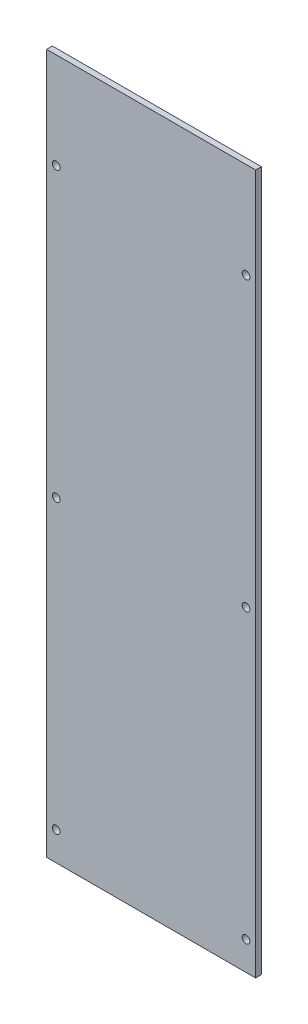
ISO-10303-21;
HEADER;
FILE_DESCRIPTION(('STEP AP214'),'2;1');
FILE_NAME('part.step','',(''),(''),'','','');
FILE_SCHEMA(('AUTOMOTIVE_DESIGN { 1 0 10303 214 1 1 1 1 }'));
ENDSEC;
DATA;
#1=APPLICATION_CONTEXT('core data for automotive mechanical design processes');
#2=APPLICATION_PROTOCOL_DEFINITION('international standard','automotive_design',2000,#1);
#3=PRODUCT_CONTEXT('',#1,'mechanical');
#4=PRODUCT('Part','Part','',(#3));
#5=PRODUCT_RELATED_PRODUCT_CATEGORY('part','',(#4));
#6=PRODUCT_DEFINITION_FORMATION('','',#4);
#7=PRODUCT_DEFINITION_CONTEXT('part definition',#1,'design');
#8=PRODUCT_DEFINITION('design','',#6,#7);
#9=PRODUCT_DEFINITION_SHAPE('','',#8);
#10=(LENGTH_UNIT() NAMED_UNIT(*) SI_UNIT(.MILLI.,.METRE.));
#11=(NAMED_UNIT(*) PLANE_ANGLE_UNIT() SI_UNIT($,.RADIAN.));
#12=(NAMED_UNIT(*) SI_UNIT($,.STERADIAN.) SOLID_ANGLE_UNIT());
#13=UNCERTAINTY_MEASURE_WITH_UNIT(LENGTH_MEASURE(1.E-05),#10,'distance_accuracy_value','');
#14=(GEOMETRIC_REPRESENTATION_CONTEXT(3) GLOBAL_UNCERTAINTY_ASSIGNED_CONTEXT((#13)) GLOBAL_UNIT_ASSIGNED_CONTEXT((#10,
#11,#12)) REPRESENTATION_CONTEXT('',''));
#15=CARTESIAN_POINT('',(0.,0.,0.));
#16=DIRECTION('',(0.,0.,1.));
#17=DIRECTION('',(1.,0.,0.));
#18=AXIS2_PLACEMENT_3D('',#15,#16,#17);
#19=CARTESIAN_POINT('',(0.,0.,3.));
#20=DIRECTION('',(0.,0.,-1.));
#21=DIRECTION('',(-1.,0.,0.));
#22=AXIS2_PLACEMENT_3D('',#19,#20,#21);
#23=PLANE('',#22);
#24=DIRECTION('',(0.,1.,0.));
#25=VECTOR('',#24,1.);
#26=CARTESIAN_POINT('',(54.4999999999942,185.000000000003,3.));
#27=LINE('',#26,#25);
#28=CARTESIAN_POINT('',(54.4999999999943,-180.,3.));
#29=VERTEX_POINT('',#28);
#30=CARTESIAN_POINT('',(54.4999999999942,185.000000000003,3.));
#31=VERTEX_POINT('',#30);
#32=EDGE_CURVE('E85',#29,#31,#27,.T.);
#33=ORIENTED_EDGE('',*,*,#32,.T.);
#34=DIRECTION('',(-1.,0.,0.));
#35=VECTOR('',#34,1.);
#36=CARTESIAN_POINT('',(-54.4999999999943,185.000000000003,3.));
#37=LINE('',#36,#35);
#38=CARTESIAN_POINT('',(-54.4999999999943,185.000000000003,3.));
#39=VERTEX_POINT('',#38);
#40=EDGE_CURVE('E80',#31,#39,#37,.T.);
#41=ORIENTED_EDGE('',*,*,#40,.T.);
#42=DIRECTION('',(0.,-1.,0.));
#43=VECTOR('',#42,1.);
#44=CARTESIAN_POINT('',(-54.4999999999943,185.000000000003,3.));
#45=LINE('',#44,#43);
#46=CARTESIAN_POINT('',(-54.4999999999943,-180.,3.));
#47=VERTEX_POINT('',#46);
#48=EDGE_CURVE('E83',#39,#47,#45,.T.);
#49=ORIENTED_EDGE('',*,*,#48,.T.);
#50=DIRECTION('',(1.,0.,0.));
#51=VECTOR('',#50,1.);
#52=CARTESIAN_POINT('',(54.4999999999943,-180.,3.));
#53=LINE('',#52,#51);
#54=EDGE_CURVE('E50',#47,#29,#53,.T.);
#55=ORIENTED_EDGE('',*,*,#54,.T.);
#56=EDGE_LOOP('',(#33,#41,#49,#55));
#57=FACE_BOUND('',#56,.T.);
#58=CARTESIAN_POINT('',(-49.4999999999975,-164.999999999995,3.));
#59=DIRECTION('',(0.,0.,1.));
#60=DIRECTION('',(1.,0.,0.));
#61=AXIS2_PLACEMENT_3D('',#58,#59,#60);
#62=CIRCLE('',#61,2.);
#63=CARTESIAN_POINT('',(-47.4999999999975,-164.999999999995,3.));
#64=VERTEX_POINT('',#63);
#65=EDGE_CURVE('E100',#64,#64,#62,.T.);
#66=ORIENTED_EDGE('',*,*,#65,.F.);
#67=EDGE_LOOP('',(#66));
#68=FACE_BOUND('',#67,.T.);
#69=CARTESIAN_POINT('',(49.4999999999942,-164.999999999995,3.));
#70=DIRECTION('',(0.,0.,1.));
#71=DIRECTION('',(1.,0.,0.));
#72=AXIS2_PLACEMENT_3D('',#69,#70,#71);
#73=CIRCLE('',#72,2.00000000000527);
#74=CARTESIAN_POINT('',(51.4999999999995,-164.999999999995,3.));
#75=VERTEX_POINT('',#74);
#76=EDGE_CURVE('E115',#75,#75,#73,.T.);
#77=ORIENTED_EDGE('',*,*,#76,.F.);
#78=EDGE_LOOP('',(#77));
#79=FACE_BOUND('',#78,.T.);
#80=CARTESIAN_POINT('',(-49.4999999999959,-14.9999999999953,3.));
#81=DIRECTION('',(0.,0.,1.));
#82=DIRECTION('',(1.,0.,0.));
#83=AXIS2_PLACEMENT_3D('',#80,#81,#82);
#84=CIRCLE('',#83,2.);
#85=CARTESIAN_POINT('',(-47.4999999999959,-14.9999999999953,3.));
#86=VERTEX_POINT('',#85);
#87=EDGE_CURVE('E121',#86,#86,#84,.T.);
#88=ORIENTED_EDGE('',*,*,#87,.F.);
#89=EDGE_LOOP('',(#88));
#90=FACE_BOUND('',#89,.T.);
#91=CARTESIAN_POINT('',(49.4999999999942,-14.9999999999953,3.));
#92=DIRECTION('',(0.,0.,1.));
#93=DIRECTION('',(1.,0.,0.));
#94=AXIS2_PLACEMENT_3D('',#91,#92,#93);
#95=CIRCLE('',#94,2.00000000000776);
#96=CARTESIAN_POINT('',(51.500000000002,-14.9999999999953,3.));
#97=VERTEX_POINT('',#96);
#98=EDGE_CURVE('E127',#97,#97,#95,.T.);
#99=ORIENTED_EDGE('',*,*,#98,.F.);
#100=EDGE_LOOP('',(#99));
#101=FACE_BOUND('',#100,.T.);
#102=CARTESIAN_POINT('',(-49.4999999999943,135.000000000005,3.));
#103=DIRECTION('',(0.,0.,1.));
#104=DIRECTION('',(1.,0.,0.));
#105=AXIS2_PLACEMENT_3D('',#102,#103,#104);
#106=CIRCLE('',#105,2.);
#107=CARTESIAN_POINT('',(-47.4999999999943,135.000000000005,3.));
#108=VERTEX_POINT('',#107);
#109=EDGE_CURVE('E133',#108,#108,#106,.T.);
#110=ORIENTED_EDGE('',*,*,#109,.F.);
#111=EDGE_LOOP('',(#110));
#112=FACE_BOUND('',#111,.T.);
#113=CARTESIAN_POINT('',(49.4999999999942,135.000000000005,3.));
#114=DIRECTION('',(0.,0.,1.));
#115=DIRECTION('',(1.,0.,0.));
#116=AXIS2_PLACEMENT_3D('',#113,#114,#115);
#117=CIRCLE('',#116,2.00000000001026);
#118=CARTESIAN_POINT('',(51.5000000000045,135.000000000005,3.));
#119=VERTEX_POINT('',#118);
#120=EDGE_CURVE('E139',#119,#119,#117,.T.);
#121=ORIENTED_EDGE('',*,*,#120,.F.);
#122=EDGE_LOOP('',(#121));
#123=FACE_BOUND('',#122,.T.);
#124=ADVANCED_FACE('F33',(#57,#68,#79,#90,#101,#112,#123),#23,.F.);
#125=CARTESIAN_POINT('',(0.,0.,0.));
#126=DIRECTION('',(0.,0.,-1.));
#127=DIRECTION('',(-1.,0.,0.));
#128=AXIS2_PLACEMENT_3D('',#125,#126,#127);
#129=PLANE('',#128);
#130=CARTESIAN_POINT('',(-49.4999999999943,135.000000000005,0.));
#131=DIRECTION('',(0.,0.,1.));
#132=DIRECTION('',(1.,0.,0.));
#133=AXIS2_PLACEMENT_3D('',#130,#131,#132);
#134=CIRCLE('',#133,2.);
#135=CARTESIAN_POINT('',(-47.4999999999943,135.000000000005,0.));
#136=VERTEX_POINT('',#135);
#137=EDGE_CURVE('E136',#136,#136,#134,.T.);
#138=ORIENTED_EDGE('',*,*,#137,.T.);
#139=EDGE_LOOP('',(#138));
#140=FACE_BOUND('',#139,.T.);
#141=CARTESIAN_POINT('',(-49.4999999999959,-14.9999999999953,0.));
#142=DIRECTION('',(0.,0.,1.));
#143=DIRECTION('',(1.,0.,0.));
#144=AXIS2_PLACEMENT_3D('',#141,#142,#143);
#145=CIRCLE('',#144,2.);
#146=CARTESIAN_POINT('',(-47.4999999999959,-14.9999999999953,0.));
#147=VERTEX_POINT('',#146);
#148=EDGE_CURVE('E124',#147,#147,#145,.T.);
#149=ORIENTED_EDGE('',*,*,#148,.T.);
#150=EDGE_LOOP('',(#149));
#151=FACE_BOUND('',#150,.T.);
#152=CARTESIAN_POINT('',(-49.4999999999975,-164.999999999995,0.));
#153=DIRECTION('',(0.,0.,1.));
#154=DIRECTION('',(1.,0.,0.));
#155=AXIS2_PLACEMENT_3D('',#152,#153,#154);
#156=CIRCLE('',#155,2.);
#157=CARTESIAN_POINT('',(-47.4999999999975,-164.999999999995,0.));
#158=VERTEX_POINT('',#157);
#159=EDGE_CURVE('E112',#158,#158,#156,.T.);
#160=ORIENTED_EDGE('',*,*,#159,.T.);
#161=EDGE_LOOP('',(#160));
#162=FACE_BOUND('',#161,.T.);
#163=DIRECTION('',(0.,1.,0.));
#164=VECTOR('',#163,1.);
#165=CARTESIAN_POINT('',(54.4999999999942,185.000000000003,0.));
#166=LINE('',#165,#164);
#167=CARTESIAN_POINT('',(54.4999999999943,-180.,0.));
#168=VERTEX_POINT('',#167);
#169=CARTESIAN_POINT('',(54.4999999999942,185.000000000003,0.));
#170=VERTEX_POINT('',#169);
#171=EDGE_CURVE('E97',#168,#170,#166,.T.);
#172=ORIENTED_EDGE('',*,*,#171,.F.);
#173=DIRECTION('',(1.,0.,0.));
#174=VECTOR('',#173,1.);
#175=CARTESIAN_POINT('',(54.4999999999943,-180.,0.));
#176=LINE('',#175,#174);
#177=CARTESIAN_POINT('',(-54.4999999999943,-180.,0.));
#178=VERTEX_POINT('',#177);
#179=EDGE_CURVE('E73',#178,#168,#176,.T.);
#180=ORIENTED_EDGE('',*,*,#179,.F.);
#181=DIRECTION('',(0.,-1.,0.));
#182=VECTOR('',#181,1.);
#183=CARTESIAN_POINT('',(-54.4999999999943,185.000000000003,0.));
#184=LINE('',#183,#182);
#185=CARTESIAN_POINT('',(-54.4999999999943,185.000000000003,0.));
#186=VERTEX_POINT('',#185);
#187=EDGE_CURVE('E67',#186,#178,#184,.T.);
#188=ORIENTED_EDGE('',*,*,#187,.F.);
#189=DIRECTION('',(-1.,0.,0.));
#190=VECTOR('',#189,1.);
#191=CARTESIAN_POINT('',(-54.4999999999943,185.000000000003,0.));
#192=LINE('',#191,#190);
#193=EDGE_CURVE('E89',#170,#186,#192,.T.);
#194=ORIENTED_EDGE('',*,*,#193,.F.);
#195=EDGE_LOOP('',(#172,#180,#188,#194));
#196=FACE_BOUND('',#195,.T.);
#197=CARTESIAN_POINT('',(49.4999999999942,-164.999999999995,0.));
#198=DIRECTION('',(0.,0.,1.));
#199=DIRECTION('',(1.,0.,0.));
#200=AXIS2_PLACEMENT_3D('',#197,#198,#199);
#201=CIRCLE('',#200,2.00000000000527);
#202=CARTESIAN_POINT('',(51.4999999999995,-164.999999999995,0.));
#203=VERTEX_POINT('',#202);
#204=EDGE_CURVE('E118',#203,#203,#201,.T.);
#205=ORIENTED_EDGE('',*,*,#204,.T.);
#206=EDGE_LOOP('',(#205));
#207=FACE_BOUND('',#206,.T.);
#208=CARTESIAN_POINT('',(49.4999999999942,-14.9999999999953,0.));
#209=DIRECTION('',(0.,0.,1.));
#210=DIRECTION('',(1.,0.,0.));
#211=AXIS2_PLACEMENT_3D('',#208,#209,#210);
#212=CIRCLE('',#211,2.00000000000776);
#213=CARTESIAN_POINT('',(51.500000000002,-14.9999999999953,0.));
#214=VERTEX_POINT('',#213);
#215=EDGE_CURVE('E130',#214,#214,#212,.T.);
#216=ORIENTED_EDGE('',*,*,#215,.T.);
#217=EDGE_LOOP('',(#216));
#218=FACE_BOUND('',#217,.T.);
#219=CARTESIAN_POINT('',(49.4999999999942,135.000000000005,0.));
#220=DIRECTION('',(0.,0.,1.));
#221=DIRECTION('',(1.,0.,0.));
#222=AXIS2_PLACEMENT_3D('',#219,#220,#221);
#223=CIRCLE('',#222,2.00000000001026);
#224=CARTESIAN_POINT('',(51.5000000000045,135.000000000005,0.));
#225=VERTEX_POINT('',#224);
#226=EDGE_CURVE('E142',#225,#225,#223,.T.);
#227=ORIENTED_EDGE('',*,*,#226,.T.);
#228=EDGE_LOOP('',(#227));
#229=FACE_BOUND('',#228,.T.);
#230=ADVANCED_FACE('F108',(#140,#151,#162,#196,#207,#218,#229),#129,.T.);
#231=CARTESIAN_POINT('',(54.4999999999942,185.000000000003,3.));
#232=DIRECTION('',(-1.,0.,0.));
#233=DIRECTION('',(0.,-1.,0.));
#234=AXIS2_PLACEMENT_3D('',#231,#232,#233);
#235=PLANE('',#234);
#236=ORIENTED_EDGE('',*,*,#171,.T.);
#237=DIRECTION('',(0.,0.,-1.));
#238=VECTOR('',#237,1.);
#239=CARTESIAN_POINT('',(54.4999999999942,185.000000000003,3.));
#240=LINE('',#239,#238);
#241=EDGE_CURVE('E11',#31,#170,#240,.T.);
#242=ORIENTED_EDGE('',*,*,#241,.F.);
#243=ORIENTED_EDGE('',*,*,#32,.F.);
#244=DIRECTION('',(0.,0.,-1.));
#245=VECTOR('',#244,1.);
#246=CARTESIAN_POINT('',(54.4999999999943,-180.,3.));
#247=LINE('',#246,#245);
#248=EDGE_CURVE('E93',#29,#168,#247,.T.);
#249=ORIENTED_EDGE('',*,*,#248,.T.);
#250=EDGE_LOOP('',(#236,#242,#243,#249));
#251=FACE_BOUND('',#250,.T.);
#252=ADVANCED_FACE('F35',(#251),#235,.F.);
#253=CARTESIAN_POINT('',(-54.4999999999943,185.000000000003,3.));
#254=DIRECTION('',(0.,-1.,0.));
#255=DIRECTION('',(0.,0.,-1.));
#256=AXIS2_PLACEMENT_3D('',#253,#254,#255);
#257=PLANE('',#256);
#258=ORIENTED_EDGE('',*,*,#193,.T.);
#259=DIRECTION('',(0.,0.,-1.));
#260=VECTOR('',#259,1.);
#261=CARTESIAN_POINT('',(-54.4999999999943,185.000000000003,3.));
#262=LINE('',#261,#260);
#263=EDGE_CURVE('E42',#39,#186,#262,.T.);
#264=ORIENTED_EDGE('',*,*,#263,.F.);
#265=ORIENTED_EDGE('',*,*,#40,.F.);
#266=ORIENTED_EDGE('',*,*,#241,.T.);
#267=EDGE_LOOP('',(#258,#264,#265,#266));
#268=FACE_BOUND('',#267,.T.);
#269=ADVANCED_FACE('F88',(#268),#257,.F.);
#270=CARTESIAN_POINT('',(-54.4999999999943,185.000000000003,3.));
#271=DIRECTION('',(1.,0.,0.));
#272=DIRECTION('',(0.,0.,-1.));
#273=AXIS2_PLACEMENT_3D('',#270,#271,#272);
#274=PLANE('',#273);
#275=ORIENTED_EDGE('',*,*,#187,.T.);
#276=DIRECTION('',(0.,0.,-1.));
#277=VECTOR('',#276,1.);
#278=CARTESIAN_POINT('',(-54.4999999999943,-180.,3.));
#279=LINE('',#278,#277);
#280=EDGE_CURVE('E90',#47,#178,#279,.T.);
#281=ORIENTED_EDGE('',*,*,#280,.F.);
#282=ORIENTED_EDGE('',*,*,#48,.F.);
#283=ORIENTED_EDGE('',*,*,#263,.T.);
#284=EDGE_LOOP('',(#275,#281,#282,#283));
#285=FACE_BOUND('',#284,.T.);
#286=ADVANCED_FACE('F91',(#285),#274,.F.);
#287=CARTESIAN_POINT('',(54.4999999999943,-180.,3.));
#288=DIRECTION('',(0.,1.,0.));
#289=DIRECTION('',(0.,0.,1.));
#290=AXIS2_PLACEMENT_3D('',#287,#288,#289);
#291=PLANE('',#290);
#292=ORIENTED_EDGE('',*,*,#179,.T.);
#293=ORIENTED_EDGE('',*,*,#248,.F.);
#294=ORIENTED_EDGE('',*,*,#54,.F.);
#295=ORIENTED_EDGE('',*,*,#280,.T.);
#296=EDGE_LOOP('',(#292,#293,#294,#295));
#297=FACE_BOUND('',#296,.T.);
#298=ADVANCED_FACE('F105',(#297),#291,.F.);
#299=CARTESIAN_POINT('',(-49.4999999999975,-164.999999999995,3.));
#300=DIRECTION('',(0.,0.,-1.));
#301=DIRECTION('',(-1.,0.,0.));
#302=AXIS2_PLACEMENT_3D('',#299,#300,#301);
#303=CYLINDRICAL_SURFACE('',#302,2.);
#304=ORIENTED_EDGE('',*,*,#65,.T.);
#305=EDGE_LOOP('',(#304));
#306=FACE_BOUND('',#305,.T.);
#307=ORIENTED_EDGE('',*,*,#159,.F.);
#308=EDGE_LOOP('',(#307));
#309=FACE_BOUND('',#308,.T.);
#310=ADVANCED_FACE('F159',(#306,#309),#303,.F.);
#311=CARTESIAN_POINT('',(49.4999999999942,-164.999999999995,3.));
#312=DIRECTION('',(0.,0.,-1.));
#313=DIRECTION('',(-1.,0.,0.));
#314=AXIS2_PLACEMENT_3D('',#311,#312,#313);
#315=CYLINDRICAL_SURFACE('',#314,2.00000000000527);
#316=ORIENTED_EDGE('',*,*,#76,.T.);
#317=EDGE_LOOP('',(#316));
#318=FACE_BOUND('',#317,.T.);
#319=ORIENTED_EDGE('',*,*,#204,.F.);
#320=EDGE_LOOP('',(#319));
#321=FACE_BOUND('',#320,.T.);
#322=ADVANCED_FACE('F205',(#318,#321),#315,.F.);
#323=CARTESIAN_POINT('',(-49.4999999999959,-14.9999999999953,3.));
#324=DIRECTION('',(0.,0.,-1.));
#325=DIRECTION('',(-1.,0.,0.));
#326=AXIS2_PLACEMENT_3D('',#323,#324,#325);
#327=CYLINDRICAL_SURFACE('',#326,2.);
#328=ORIENTED_EDGE('',*,*,#87,.T.);
#329=EDGE_LOOP('',(#328));
#330=FACE_BOUND('',#329,.T.);
#331=ORIENTED_EDGE('',*,*,#148,.F.);
#332=EDGE_LOOP('',(#331));
#333=FACE_BOUND('',#332,.T.);
#334=ADVANCED_FACE('F213',(#330,#333),#327,.F.);
#335=CARTESIAN_POINT('',(49.4999999999942,-14.9999999999953,3.));
#336=DIRECTION('',(0.,0.,-1.));
#337=DIRECTION('',(-1.,0.,0.));
#338=AXIS2_PLACEMENT_3D('',#335,#336,#337);
#339=CYLINDRICAL_SURFACE('',#338,2.00000000000776);
#340=ORIENTED_EDGE('',*,*,#98,.T.);
#341=EDGE_LOOP('',(#340));
#342=FACE_BOUND('',#341,.T.);
#343=ORIENTED_EDGE('',*,*,#215,.F.);
#344=EDGE_LOOP('',(#343));
#345=FACE_BOUND('',#344,.T.);
#346=ADVANCED_FACE('F221',(#342,#345),#339,.F.);
#347=CARTESIAN_POINT('',(-49.4999999999943,135.000000000005,3.));
#348=DIRECTION('',(0.,0.,-1.));
#349=DIRECTION('',(-1.,0.,0.));
#350=AXIS2_PLACEMENT_3D('',#347,#348,#349);
#351=CYLINDRICAL_SURFACE('',#350,2.);
#352=ORIENTED_EDGE('',*,*,#109,.T.);
#353=EDGE_LOOP('',(#352));
#354=FACE_BOUND('',#353,.T.);
#355=ORIENTED_EDGE('',*,*,#137,.F.);
#356=EDGE_LOOP('',(#355));
#357=FACE_BOUND('',#356,.T.);
#358=ADVANCED_FACE('F230',(#354,#357),#351,.F.);
#359=CARTESIAN_POINT('',(49.4999999999942,135.000000000005,3.));
#360=DIRECTION('',(0.,0.,-1.));
#361=DIRECTION('',(-1.,0.,0.));
#362=AXIS2_PLACEMENT_3D('',#359,#360,#361);
#363=CYLINDRICAL_SURFACE('',#362,2.00000000001026);
#364=ORIENTED_EDGE('',*,*,#120,.T.);
#365=EDGE_LOOP('',(#364));
#366=FACE_BOUND('',#365,.T.);
#367=ORIENTED_EDGE('',*,*,#226,.F.);
#368=EDGE_LOOP('',(#367));
#369=FACE_BOUND('',#368,.T.);
#370=ADVANCED_FACE('F148',(#366,#369),#363,.F.);
#371=CLOSED_SHELL('',(#124,#230,#252,#269,#286,#298,#310,#322,#334,#346,#358,#370));
#372=MANIFOLD_SOLID_BREP('B2',#371);
#373=ADVANCED_BREP_SHAPE_REPRESENTATION('',(#18,#372),#14);
#374=SHAPE_DEFINITION_REPRESENTATION(#9,#373);
ENDSEC;
END-ISO-10303-21;
